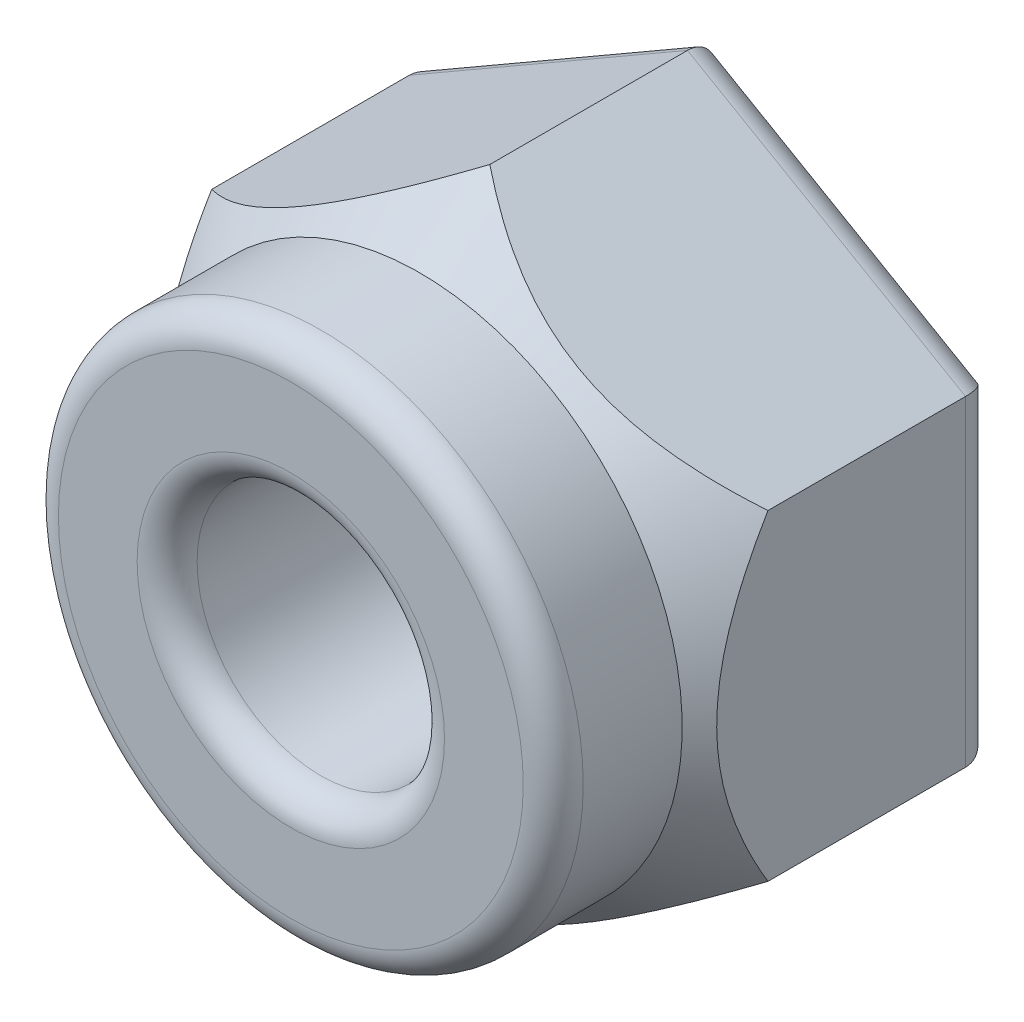
ISO-10303-21;
HEADER;
FILE_DESCRIPTION(('STEP AP214'),'2;1');
FILE_NAME('part.step','',(''),(''),'','','');
FILE_SCHEMA(('AUTOMOTIVE_DESIGN { 1 0 10303 214 1 1 1 1 }'));
ENDSEC;
DATA;
#1=APPLICATION_CONTEXT('core data for automotive mechanical design processes');
#2=APPLICATION_PROTOCOL_DEFINITION('international standard','automotive_design',2000,#1);
#3=PRODUCT_CONTEXT('',#1,'mechanical');
#4=PRODUCT('Part','Part','',(#3));
#5=PRODUCT_RELATED_PRODUCT_CATEGORY('part','',(#4));
#6=PRODUCT_DEFINITION_FORMATION('','',#4);
#7=PRODUCT_DEFINITION_CONTEXT('part definition',#1,'design');
#8=PRODUCT_DEFINITION('design','',#6,#7);
#9=PRODUCT_DEFINITION_SHAPE('','',#8);
#10=(LENGTH_UNIT() NAMED_UNIT(*) SI_UNIT(.MILLI.,.METRE.));
#11=(NAMED_UNIT(*) PLANE_ANGLE_UNIT() SI_UNIT($,.RADIAN.));
#12=(NAMED_UNIT(*) SI_UNIT($,.STERADIAN.) SOLID_ANGLE_UNIT());
#13=UNCERTAINTY_MEASURE_WITH_UNIT(LENGTH_MEASURE(1.E-05),#10,'distance_accuracy_value','');
#14=(GEOMETRIC_REPRESENTATION_CONTEXT(3) GLOBAL_UNCERTAINTY_ASSIGNED_CONTEXT((#13)) GLOBAL_UNIT_ASSIGNED_CONTEXT((#10,
#11,#12)) REPRESENTATION_CONTEXT('',''));
#15=CARTESIAN_POINT('',(0.,0.,0.));
#16=DIRECTION('',(0.,0.,1.));
#17=DIRECTION('',(1.,0.,0.));
#18=AXIS2_PLACEMENT_3D('',#15,#16,#17);
#19=CARTESIAN_POINT('',(0.,0.,7.2263));
#20=DIRECTION('',(0.,0.,-1.));
#21=DIRECTION('',(-1.,0.,0.));
#22=AXIS2_PLACEMENT_3D('',#19,#20,#21);
#23=CYLINDRICAL_SURFACE('',#22,4.445);
#24=CARTESIAN_POINT('',(0.,0.,5.04190000003746));
#25=DIRECTION('',(0.,0.,-1.));
#26=DIRECTION('',(-1.,0.,0.));
#27=AXIS2_PLACEMENT_3D('',#24,#25,#26);
#28=CIRCLE('',#27,4.44499999997561);
#29=CARTESIAN_POINT('',(-4.44499999997561,0.,5.04190000003746));
#30=VERTEX_POINT('',#29);
#31=EDGE_CURVE('E314',#30,#30,#28,.T.);
#32=ORIENTED_EDGE('',*,*,#31,.F.);
#33=EDGE_LOOP('',(#32));
#34=FACE_BOUND('',#33,.T.);
#35=CARTESIAN_POINT('',(0.,0.,6.7183));
#36=DIRECTION('',(0.,0.,1.));
#37=DIRECTION('',(1.,0.,0.));
#38=AXIS2_PLACEMENT_3D('',#35,#36,#37);
#39=CIRCLE('',#38,4.445);
#40=CARTESIAN_POINT('',(4.445,0.,6.7183));
#41=VERTEX_POINT('',#40);
#42=EDGE_CURVE('E322',#41,#41,#39,.T.);
#43=ORIENTED_EDGE('',*,*,#42,.F.);
#44=EDGE_LOOP('',(#43));
#45=FACE_BOUND('',#44,.T.);
#46=ADVANCED_FACE('F17',(#34,#45),#23,.T.);
#47=CARTESIAN_POINT('',(0.,0.,6.7183));
#48=DIRECTION('',(0.,0.,1.));
#49=DIRECTION('',(1.,0.,0.));
#50=AXIS2_PLACEMENT_3D('',#47,#48,#49);
#51=TOROIDAL_SURFACE('',#50,3.937,0.508);
#52=ORIENTED_EDGE('',*,*,#42,.T.);
#53=EDGE_LOOP('',(#52));
#54=FACE_BOUND('',#53,.T.);
#55=CARTESIAN_POINT('',(0.,0.,7.2263));
#56=DIRECTION('',(0.,0.,-1.));
#57=DIRECTION('',(1.,0.,0.));
#58=AXIS2_PLACEMENT_3D('',#55,#56,#57);
#59=CIRCLE('',#58,3.937);
#60=CARTESIAN_POINT('',(-3.937,0.,7.2263));
#61=VERTEX_POINT('',#60);
#62=CARTESIAN_POINT('',(3.937,0.,7.2263));
#63=VERTEX_POINT('',#62);
#64=EDGE_CURVE('E123',#61,#63,#59,.F.);
#65=ORIENTED_EDGE('',*,*,#64,.F.);
#66=CARTESIAN_POINT('',(0.,0.,7.2263));
#67=DIRECTION('',(0.,0.,-1.));
#68=DIRECTION('',(-1.,0.,0.));
#69=AXIS2_PLACEMENT_3D('',#66,#67,#68);
#70=CIRCLE('',#69,3.937);
#71=EDGE_CURVE('E96',#63,#61,#70,.F.);
#72=ORIENTED_EDGE('',*,*,#71,.F.);
#73=EDGE_LOOP('',(#65,#72));
#74=FACE_BOUND('',#73,.T.);
#75=ADVANCED_FACE('F165',(#54,#74),#51,.T.);
#76=CARTESIAN_POINT('',(0.,0.,3.84826803468741));
#77=DIRECTION('',(0.,0.,-1.));
#78=DIRECTION('',(-1.,0.,0.));
#79=AXIS2_PLACEMENT_3D('',#76,#77,#78);
#80=CONICAL_SURFACE('',#79,5.44657614187827,0.698131700786655);
#81=CARTESIAN_POINT('',(-1.05212635893412E-11,-5.4406025266876,3.85538711205183));
#82=CARTESIAN_POINT('',(0.0694198880657198,-5.40052293561966,3.9031448185967));
#83=CARTESIAN_POINT('',(0.139436070913134,-5.36009907360508,3.94974429032988));
#84=CARTESIAN_POINT('',(0.280788395337334,-5.27848927104819,4.04028223932267));
#85=CARTESIAN_POINT('',(0.352125145239235,-5.23730297928921,4.08421944826291));
#86=CARTESIAN_POINT('',(0.569076561166518,-5.11204602090252,4.21196533638157));
#87=CARTESIAN_POINT('',(0.71679745732688,-5.02675932173941,4.29112317393485));
#88=CARTESIAN_POINT('',(1.01853143538914,-4.85255312828151,4.43340756846604));
#89=CARTESIAN_POINT('',(1.17256221145164,-4.76362341825833,4.49648486966023));
#90=CARTESIAN_POINT('',(1.48565710023799,-4.58285799993564,4.60156597765566));
#91=CARTESIAN_POINT('',(1.64470637680685,-4.49103085729419,4.64362665851456));
#92=CARTESIAN_POINT('',(1.90795376102741,-4.33904490915099,4.69206962952762));
#93=CARTESIAN_POINT('',(2.01114804796432,-4.27946565980913,4.70585720852341));
#94=CARTESIAN_POINT('',(2.2182299788025,-4.1599068512954,4.72266472550832));
#95=CARTESIAN_POINT('',(2.3221177381314,-4.09992722548135,4.7256828237741));
#96=CARTESIAN_POINT('',(2.52913345152588,-3.98040664762657,4.72079402245974));
#97=CARTESIAN_POINT('',(2.63226247651206,-3.92086507728953,4.71294610971281));
#98=CARTESIAN_POINT('',(2.83751260976731,-3.80236385760341,4.68682455964085));
#99=CARTESIAN_POINT('',(2.93963366743113,-3.74340423747127,4.66855040154474));
#100=CARTESIAN_POINT('',(3.17043006440187,-3.61015387555222,4.61596006584314));
#101=CARTESIAN_POINT('',(3.29858413304203,-3.53616408952507,4.57859436416838));
#102=CARTESIAN_POINT('',(3.55138157924973,-3.39021141590661,4.49043444957154));
#103=CARTESIAN_POINT('',(3.67602299619301,-3.31824966028223,4.4396328953518));
#104=CARTESIAN_POINT('',(3.92196452921464,-3.17625524998729,4.32680346167458));
#105=CARTESIAN_POINT('',(4.04324919674871,-3.10623151453792,4.26473126773521));
#106=CARTESIAN_POINT('',(4.28202359863016,-2.96837504933607,4.13169736031934));
#107=CARTESIAN_POINT('',(4.39951459789339,-2.90054158928409,4.06073864917339));
#108=CARTESIAN_POINT('',(4.54832675973965,-2.81462484758345,3.96494985301448));
#109=CARTESIAN_POINT('',(4.58125036522079,-2.79561639509622,3.94337623833501));
#110=CARTESIAN_POINT('',(4.64672541736746,-2.75781435611414,3.89974829310632));
#111=CARTESIAN_POINT('',(4.67927768775033,-2.73902029404586,3.87769561134052));
#112=CARTESIAN_POINT('',(4.71170000001052,-2.72030126333469,3.85538711205183));
#113=B_SPLINE_CURVE_WITH_KNOTS('',3,(#81,#82,#83,#84,#85,#86,#87,#88,#89,#90,#91,#92,#93,#94,
#95,#96,#97,#98,#99,#100,#101,#102,#103,#104,#105,#106,#107,#108,#109,#110,#111,#112),
.UNSPECIFIED.,.F.,.F.,(4,2,2,2,2,2,2,2,2,2,2,2,2,2,2,4),(0.,0.279903528989032,0.559939374049117,
1.12338713772598,1.68854058731442,2.25215625181163,2.61157969109433,2.97106452684174,
3.32860550907442,3.68616435136073,4.14325495933245,4.60059583767107,5.05977546426689,
5.5188003723664,5.64993318826009,5.78066992692891),.UNSPECIFIED.);
#114=CARTESIAN_POINT('',(0.,-5.4406025266876,3.85538711205183));
#115=VERTEX_POINT('',#114);
#116=CARTESIAN_POINT('',(4.71170000000526,-2.7203012633438,3.85538711205183));
#117=VERTEX_POINT('',#116);
#118=EDGE_CURVE('E181',#115,#117,#113,.T.);
#119=ORIENTED_EDGE('',*,*,#118,.T.);
#120=CARTESIAN_POINT('',(4.7117,-2.72030126335291,3.85538711205183));
#121=CARTESIAN_POINT('',(4.7117,-2.6402063734187,3.90310649914751));
#122=CARTESIAN_POINT('',(4.7117,-2.55942412822034,3.94966948672825));
#123=CARTESIAN_POINT('',(4.7117,-2.39633787939989,4.0401391045916));
#124=CARTESIAN_POINT('',(4.7117,-2.31403317291738,4.0840444658659));
#125=CARTESIAN_POINT('',(4.7117,-2.06365919564088,4.21173761478695));
#126=CARTESIAN_POINT('',(4.71170000000001,-1.89315908643086,4.29087796202629));
#127=CARTESIAN_POINT('',(4.71169999999999,-1.54468800802967,4.43323224350543));
#128=CARTESIAN_POINT('',(4.71169999999996,-1.36668835921238,4.496377038607));
#129=CARTESIAN_POINT('',(4.71170000000004,-1.00494185519992,4.60153568979534));
#130=CARTESIAN_POINT('',(4.71170000000014,-0.821215118617015,4.64361623174202));
#131=CARTESIAN_POINT('',(4.71169999999992,-0.530351814319387,4.68997218617668));
#132=CARTESIAN_POINT('',(4.71169999999976,-0.424531297372244,4.70272811664239));
#133=CARTESIAN_POINT('',(4.71170000000024,-0.212474460441832,4.71976101883668));
#134=CARTESIAN_POINT('',(4.71170000000087,-0.106239966047499,4.72406020266148));
#135=CARTESIAN_POINT('',(4.71170000000098,0.121493750615701,4.7240583039678));
#136=CARTESIAN_POINT('',(4.71170000000026,0.242994656906167,4.71843378046611));
#137=CARTESIAN_POINT('',(4.71169999999974,0.485033821464658,4.69621922586504));
#138=CARTESIAN_POINT('',(4.71169999999993,0.60557155803917,4.67962361248845));
#139=CARTESIAN_POINT('',(4.71170000000007,0.84556427974083,4.63611795709083));
#140=CARTESIAN_POINT('',(4.71170000000002,0.965006984855056,4.60914100452643));
#141=CARTESIAN_POINT('',(4.71169999999998,1.20144845904031,4.54600958617114));
#142=CARTESIAN_POINT('',(4.71169999999999,1.31844653742098,4.50985256365227));
#143=CARTESIAN_POINT('',(4.7117,1.54724944788919,4.43045830591636));
#144=CARTESIAN_POINT('',(4.7117,1.65911171411081,4.38738487549243));
#145=CARTESIAN_POINT('',(4.7117,1.88014178446137,4.29476923627468));
#146=CARTESIAN_POINT('',(4.7117,1.98930884468368,4.24522526475784));
#147=CARTESIAN_POINT('',(4.7117,2.20353742687643,4.14141189108925));
#148=CARTESIAN_POINT('',(4.7117,2.30863443928403,4.08721511005738));
#149=CARTESIAN_POINT('',(4.7117,2.5162956180647,3.9744127080225));
#150=CARTESIAN_POINT('',(4.7117,2.61886238134765,3.91581188043125));
#151=CARTESIAN_POINT('',(4.7117,2.72030126335291,3.85538711205183));
#152=B_SPLINE_CURVE_WITH_KNOTS('',3,(#120,#121,#122,#123,#124,#125,#126,#127,#128,#129,#130,
#131,#132,#133,#134,#135,#136,#137,#138,#139,#140,#141,#142,#143,#144,#145,#146,#147,#148,#149,
#150,#151),.UNSPECIFIED.,.F.,.F.,(4,2,2,2,2,2,2,2,2,2,2,2,2,2,2,4),(0.,0.279678877148154,
0.559490263399245,1.12271646698533,1.68833714234389,2.25215565075588,2.57161647601366,
2.89023709399887,3.25460481118364,3.61915806770462,3.98610142374424,4.3531470889663,
4.71252002169859,5.07199106082915,5.42662119563383,5.7808707865877),.UNSPECIFIED.);
#153=CARTESIAN_POINT('',(4.71170000000526,2.7203012633438,3.85538711205183));
#154=VERTEX_POINT('',#153);
#155=EDGE_CURVE('E172',#117,#154,#152,.T.);
#156=ORIENTED_EDGE('',*,*,#155,.T.);
#157=CARTESIAN_POINT('',(4.71170000001052,2.72030126333468,3.85538711205183));
#158=CARTESIAN_POINT('',(4.64228011193428,2.76038085440262,3.9031448185967));
#159=CARTESIAN_POINT('',(4.57226392908687,2.8008047164172,3.94974429032989));
#160=CARTESIAN_POINT('',(4.43091160466267,2.88241451897409,4.04028223932267));
#161=CARTESIAN_POINT('',(4.35957485476077,2.92360081073307,4.08421944826291));
#162=CARTESIAN_POINT('',(4.14262343883348,3.04885776911975,4.21196533638157));
#163=CARTESIAN_POINT('',(3.99490254267312,3.13414446828287,4.29112317393486));
#164=CARTESIAN_POINT('',(3.69316856461086,3.30835066174077,4.43340756846604));
#165=CARTESIAN_POINT('',(3.53913778854836,3.39728037176395,4.49648486966023));
#166=CARTESIAN_POINT('',(3.22604289976202,3.57804579008664,4.60156597765566));
#167=CARTESIAN_POINT('',(3.06699362319315,3.66987293272809,4.64362665851456));
#168=CARTESIAN_POINT('',(2.80374623897259,3.82185888087129,4.69206962952762));
#169=CARTESIAN_POINT('',(2.70055195203568,3.88143813021315,4.70585720852341));
#170=CARTESIAN_POINT('',(2.4934700211975,4.00099693872688,4.72266472550832));
#171=CARTESIAN_POINT('',(2.3895822618686,4.06097656454093,4.7256828237741));
#172=CARTESIAN_POINT('',(2.18256654847412,4.18049714239571,4.72079402245974));
#173=CARTESIAN_POINT('',(2.07943752348795,4.24003871273274,4.71294610971281));
#174=CARTESIAN_POINT('',(1.87418739023269,4.35853993241887,4.68682455964085));
#175=CARTESIAN_POINT('',(1.77206633256887,4.41749955255101,4.66855040154475));
#176=CARTESIAN_POINT('',(1.54126993559813,4.55074991447006,4.61596006584314));
#177=CARTESIAN_POINT('',(1.41311586695797,4.62473970049721,4.57859436416839));
#178=CARTESIAN_POINT('',(1.16031842075027,4.77069237411567,4.49043444957154));
#179=CARTESIAN_POINT('',(1.03567700380699,4.84265412974005,4.4396328953518));
#180=CARTESIAN_POINT('',(0.789735470785362,4.98464854003499,4.32680346167458));
#181=CARTESIAN_POINT('',(0.668450803251295,5.05467227548436,4.26473126773521));
#182=CARTESIAN_POINT('',(0.429676401369839,5.19252874068621,4.13169736031934));
#183=CARTESIAN_POINT('',(0.312185402106615,5.26036220073819,4.0607386491734));
#184=CARTESIAN_POINT('',(0.163373240260348,5.34627894243883,3.96494985301449));
#185=CARTESIAN_POINT('',(0.130449634779208,5.36528739492605,3.94337623833502));
#186=CARTESIAN_POINT('',(0.0649745826325351,5.40308943390814,3.89974829310632));
#187=CARTESIAN_POINT('',(0.0324223122496691,5.42188349597642,3.87769561134052));
#188=CARTESIAN_POINT('',(-1.05244750943519E-11,5.4406025266876,3.85538711205183));
#189=B_SPLINE_CURVE_WITH_KNOTS('',3,(#157,#158,#159,#160,#161,#162,#163,#164,#165,#166,#167,
#168,#169,#170,#171,#172,#173,#174,#175,#176,#177,#178,#179,#180,#181,#182,#183,#184,#185,#186,
#187,#188),.UNSPECIFIED.,.F.,.F.,(4,2,2,2,2,2,2,2,2,2,2,2,2,2,2,4),(0.,0.279903528989032,
0.559939374049118,1.12338713772598,1.68854058731442,2.25215625181163,2.61157969109433,
2.97106452684175,3.32860550907442,3.68616435136073,4.14325495933245,4.60059583767107,
5.05977546426689,5.5188003723664,5.64993318826009,5.78066992692891),.UNSPECIFIED.);
#190=CARTESIAN_POINT('',(0.,5.4406025266876,3.85538711205183));
#191=VERTEX_POINT('',#190);
#192=EDGE_CURVE('E137',#154,#191,#189,.T.);
#193=ORIENTED_EDGE('',*,*,#192,.T.);
#194=CARTESIAN_POINT('',(1.05197955628089E-11,5.4406025266876,3.85538711205183));
#195=CARTESIAN_POINT('',(-0.0694198880657212,5.40052293561966,3.9031448185967));
#196=CARTESIAN_POINT('',(-0.139436070913136,5.36009907360508,3.94974429032988));
#197=CARTESIAN_POINT('',(-0.280788395337336,5.27848927104819,4.04028223932267));
#198=CARTESIAN_POINT('',(-0.352125145239237,5.23730297928921,4.08421944826291));
#199=CARTESIAN_POINT('',(-0.569076561166519,5.11204602090252,4.21196533638157));
#200=CARTESIAN_POINT('',(-0.716797457326881,5.02675932173941,4.29112317393485));
#201=CARTESIAN_POINT('',(-1.01853143538914,4.85255312828151,4.43340756846604));
#202=CARTESIAN_POINT('',(-1.17256221145164,4.76362341825833,4.49648486966023));
#203=CARTESIAN_POINT('',(-1.48565710023799,4.58285799993564,4.60156597765566));
#204=CARTESIAN_POINT('',(-1.64470637680685,4.49103085729419,4.64362665851456));
#205=CARTESIAN_POINT('',(-1.90795376102741,4.33904490915099,4.69206962952762));
#206=CARTESIAN_POINT('',(-2.01114804796432,4.27946565980913,4.70585720852341));
#207=CARTESIAN_POINT('',(-2.2182299788025,4.1599068512954,4.72266472550832));
#208=CARTESIAN_POINT('',(-2.3221177381314,4.09992722548135,4.7256828237741));
#209=CARTESIAN_POINT('',(-2.52913345152588,3.98040664762657,4.72079402245974));
#210=CARTESIAN_POINT('',(-2.63226247651205,3.92086507728954,4.71294610971281));
#211=CARTESIAN_POINT('',(-2.83751260976731,3.80236385760341,4.68682455964085));
#212=CARTESIAN_POINT('',(-2.93963366743113,3.74340423747127,4.66855040154474));
#213=CARTESIAN_POINT('',(-3.17043006440187,3.61015387555222,4.61596006584314));
#214=CARTESIAN_POINT('',(-3.29858413304203,3.53616408952507,4.57859436416838));
#215=CARTESIAN_POINT('',(-3.55138157924973,3.39021141590661,4.49043444957154));
#216=CARTESIAN_POINT('',(-3.67602299619301,3.31824966028223,4.4396328953518));
#217=CARTESIAN_POINT('',(-3.92196452921464,3.17625524998729,4.32680346167458));
#218=CARTESIAN_POINT('',(-4.04324919674871,3.10623151453792,4.26473126773521));
#219=CARTESIAN_POINT('',(-4.28202359863016,2.96837504933607,4.13169736031934));
#220=CARTESIAN_POINT('',(-4.39951459789339,2.90054158928409,4.06073864917339));
#221=CARTESIAN_POINT('',(-4.54832675973965,2.81462484758345,3.96494985301448));
#222=CARTESIAN_POINT('',(-4.58125036522079,2.79561639509623,3.94337623833501));
#223=CARTESIAN_POINT('',(-4.64672541736746,2.75781435611414,3.89974829310632));
#224=CARTESIAN_POINT('',(-4.67927768775033,2.73902029404586,3.87769561134051));
#225=CARTESIAN_POINT('',(-4.71170000001052,2.72030126333469,3.85538711205183));
#226=B_SPLINE_CURVE_WITH_KNOTS('',3,(#194,#195,#196,#197,#198,#199,#200,#201,#202,#203,#204,
#205,#206,#207,#208,#209,#210,#211,#212,#213,#214,#215,#216,#217,#218,#219,#220,#221,#222,#223,
#224,#225),.UNSPECIFIED.,.F.,.F.,(4,2,2,2,2,2,2,2,2,2,2,2,2,2,2,4),(0.,0.279903528989032,
0.559939374049118,1.12338713772598,1.68854058731442,2.25215625181163,2.61157969109433,
2.97106452684174,3.32860550907442,3.68616435136073,4.14325495933245,4.60059583767106,
5.05977546426689,5.5188003723664,5.64993318826009,5.78066992692891),.UNSPECIFIED.);
#227=CARTESIAN_POINT('',(-4.7117,2.72030126334684,3.85538711205545));
#228=VERTEX_POINT('',#227);
#229=EDGE_CURVE('E128',#191,#228,#226,.T.);
#230=ORIENTED_EDGE('',*,*,#229,.T.);
#231=CARTESIAN_POINT('',(-4.7117,2.72030126335291,3.85538711205183));
#232=CARTESIAN_POINT('',(-4.7117,2.6402063734187,3.90310649914751));
#233=CARTESIAN_POINT('',(-4.7117,2.55942412822034,3.94966948672825));
#234=CARTESIAN_POINT('',(-4.7117,2.39633787939989,4.04013910459159));
#235=CARTESIAN_POINT('',(-4.7117,2.31403317291738,4.0840444658659));
#236=CARTESIAN_POINT('',(-4.7117,2.06365919564088,4.21173761478695));
#237=CARTESIAN_POINT('',(-4.71170000000001,1.89315908643086,4.29087796202629));
#238=CARTESIAN_POINT('',(-4.71169999999999,1.54468800802967,4.43323224350543));
#239=CARTESIAN_POINT('',(-4.71169999999996,1.36668835921238,4.496377038607));
#240=CARTESIAN_POINT('',(-4.71170000000004,1.00494185519992,4.60153568979534));
#241=CARTESIAN_POINT('',(-4.71170000000014,0.821215118617016,4.64361623174201));
#242=CARTESIAN_POINT('',(-4.71169999999992,0.530351814319387,4.68997218617668));
#243=CARTESIAN_POINT('',(-4.71169999999976,0.424531297372245,4.70272811664239));
#244=CARTESIAN_POINT('',(-4.71170000000024,0.212474460441832,4.71976101883668));
#245=CARTESIAN_POINT('',(-4.71170000000087,0.1062399660475,4.72406020266148));
#246=CARTESIAN_POINT('',(-4.71170000000098,-0.121493750615701,4.7240583039678));
#247=CARTESIAN_POINT('',(-4.71170000000026,-0.242994656906166,4.71843378046611));
#248=CARTESIAN_POINT('',(-4.71169999999974,-0.485033821464658,4.69621922586504));
#249=CARTESIAN_POINT('',(-4.71169999999993,-0.60557155803917,4.67962361248845));
#250=CARTESIAN_POINT('',(-4.71170000000007,-0.84556427974083,4.63611795709083));
#251=CARTESIAN_POINT('',(-4.71170000000002,-0.965006984855056,4.60914100452643));
#252=CARTESIAN_POINT('',(-4.71169999999998,-1.20144845904031,4.54600958617114));
#253=CARTESIAN_POINT('',(-4.71169999999999,-1.31844653742098,4.50985256365227));
#254=CARTESIAN_POINT('',(-4.7117,-1.54724944788919,4.43045830591636));
#255=CARTESIAN_POINT('',(-4.7117,-1.65911171411081,4.38738487549243));
#256=CARTESIAN_POINT('',(-4.7117,-1.88014178446137,4.29476923627468));
#257=CARTESIAN_POINT('',(-4.7117,-1.98930884468368,4.24522526475784));
#258=CARTESIAN_POINT('',(-4.7117,-2.20353742687644,4.14141189108925));
#259=CARTESIAN_POINT('',(-4.7117,-2.30863443928403,4.08721511005738));
#260=CARTESIAN_POINT('',(-4.7117,-2.5162956180647,3.9744127080225));
#261=CARTESIAN_POINT('',(-4.7117,-2.61886238134765,3.91581188043125));
#262=CARTESIAN_POINT('',(-4.7117,-2.72030126335291,3.85538711205183));
#263=B_SPLINE_CURVE_WITH_KNOTS('',3,(#231,#232,#233,#234,#235,#236,#237,#238,#239,#240,#241,
#242,#243,#244,#245,#246,#247,#248,#249,#250,#251,#252,#253,#254,#255,#256,#257,#258,#259,#260,
#261,#262),.UNSPECIFIED.,.F.,.F.,(4,2,2,2,2,2,2,2,2,2,2,2,2,2,2,4),(0.,0.279678877148154,
0.559490263399245,1.12271646698533,1.68833714234389,2.25215565075588,2.57161647601366,
2.89023709399887,3.25460481118364,3.61915806770462,3.98610142374424,4.3531470889663,
4.71252002169859,5.07199106082915,5.42662119563384,5.7808707865877),.UNSPECIFIED.);
#264=CARTESIAN_POINT('',(-4.71170000000526,-2.7203012633438,3.85538711205183));
#265=VERTEX_POINT('',#264);
#266=EDGE_CURVE('E114',#228,#265,#263,.T.);
#267=ORIENTED_EDGE('',*,*,#266,.T.);
#268=CARTESIAN_POINT('',(-4.71170000001052,-2.72030126333469,3.85538711205183));
#269=CARTESIAN_POINT('',(-4.64228011193428,-2.76038085440262,3.9031448185967));
#270=CARTESIAN_POINT('',(-4.57226392908687,-2.8008047164172,3.94974429032989));
#271=CARTESIAN_POINT('',(-4.43091160466267,-2.88241451897409,4.04028223932267));
#272=CARTESIAN_POINT('',(-4.35957485476076,-2.92360081073307,4.08421944826291));
#273=CARTESIAN_POINT('',(-4.14262343883348,-3.04885776911976,4.21196533638157));
#274=CARTESIAN_POINT('',(-3.99490254267312,-3.13414446828287,4.29112317393485));
#275=CARTESIAN_POINT('',(-3.69316856461087,-3.30835066174077,4.43340756846604));
#276=CARTESIAN_POINT('',(-3.53913778854836,-3.39728037176395,4.49648486966023));
#277=CARTESIAN_POINT('',(-3.22604289976202,-3.57804579008664,4.60156597765566));
#278=CARTESIAN_POINT('',(-3.06699362319316,-3.66987293272809,4.64362665851456));
#279=CARTESIAN_POINT('',(-2.80374623897259,-3.82185888087129,4.69206962952762));
#280=CARTESIAN_POINT('',(-2.70055195203569,-3.88143813021315,4.70585720852341));
#281=CARTESIAN_POINT('',(-2.49347002119751,-4.00099693872688,4.72266472550832));
#282=CARTESIAN_POINT('',(-2.38958226186861,-4.06097656454093,4.7256828237741));
#283=CARTESIAN_POINT('',(-2.18256654847413,-4.18049714239571,4.72079402245974));
#284=CARTESIAN_POINT('',(-2.07943752348795,-4.24003871273274,4.71294610971281));
#285=CARTESIAN_POINT('',(-1.8741873902327,-4.35853993241887,4.68682455964085));
#286=CARTESIAN_POINT('',(-1.77206633256888,-4.41749955255101,4.66855040154474));
#287=CARTESIAN_POINT('',(-1.54126993559814,-4.55074991447006,4.61596006584314));
#288=CARTESIAN_POINT('',(-1.41311586695797,-4.62473970049721,4.57859436416838));
#289=CARTESIAN_POINT('',(-1.16031842075028,-4.77069237411567,4.49043444957154));
#290=CARTESIAN_POINT('',(-1.035677003807,-4.84265412974005,4.4396328953518));
#291=CARTESIAN_POINT('',(-0.789735470785368,-4.98464854003499,4.32680346167458));
#292=CARTESIAN_POINT('',(-0.6684508032513,-5.05467227548436,4.26473126773521));
#293=CARTESIAN_POINT('',(-0.429676401369845,-5.19252874068621,4.13169736031934));
#294=CARTESIAN_POINT('',(-0.312185402106622,-5.26036220073819,4.06073864917339));
#295=CARTESIAN_POINT('',(-0.163373240260353,-5.34627894243883,3.96494985301448));
#296=CARTESIAN_POINT('',(-0.130449634779214,-5.36528739492605,3.94337623833501));
#297=CARTESIAN_POINT('',(-0.0649745826325401,-5.40308943390814,3.89974829310632));
#298=CARTESIAN_POINT('',(-0.0324223122496736,-5.42188349597642,3.87769561134052));
#299=CARTESIAN_POINT('',(1.05200175076249E-11,-5.4406025266876,3.85538711205183));
#300=B_SPLINE_CURVE_WITH_KNOTS('',3,(#268,#269,#270,#271,#272,#273,#274,#275,#276,#277,#278,
#279,#280,#281,#282,#283,#284,#285,#286,#287,#288,#289,#290,#291,#292,#293,#294,#295,#296,#297,
#298,#299),.UNSPECIFIED.,.F.,.F.,(4,2,2,2,2,2,2,2,2,2,2,2,2,2,2,4),(0.,0.279903528989032,
0.559939374049116,1.12338713772598,1.68854058731442,2.25215625181162,2.61157969109432,
2.97106452684174,3.32860550907442,3.68616435136073,4.14325495933245,4.60059583767106,
5.05977546426688,5.51880037236639,5.64993318826008,5.78066992692891),.UNSPECIFIED.);
#301=EDGE_CURVE('E89',#265,#115,#300,.T.);
#302=ORIENTED_EDGE('',*,*,#301,.T.);
#303=EDGE_LOOP('',(#119,#156,#193,#230,#267,#302));
#304=FACE_BOUND('',#303,.T.);
#305=ORIENTED_EDGE('',*,*,#31,.T.);
#306=EDGE_LOOP('',(#305));
#307=FACE_BOUND('',#306,.T.);
#308=ADVANCED_FACE('F134',(#304,#307),#80,.T.);
#309=CARTESIAN_POINT('',(0.,0.,7.2263));
#310=DIRECTION('',(0.,0.,1.));
#311=DIRECTION('',(1.,0.,0.));
#312=AXIS2_PLACEMENT_3D('',#309,#310,#311);
#313=PLANE('',#312);
#314=ORIENTED_EDGE('',*,*,#71,.T.);
#315=ORIENTED_EDGE('',*,*,#64,.T.);
#316=EDGE_LOOP('',(#314,#315));
#317=FACE_BOUND('',#316,.T.);
#318=CARTESIAN_POINT('',(0.,0.,7.2263));
#319=DIRECTION('',(0.,0.,1.));
#320=DIRECTION('',(-1.,0.,0.));
#321=AXIS2_PLACEMENT_3D('',#318,#319,#320);
#322=CIRCLE('',#321,2.6035);
#323=CARTESIAN_POINT('',(-2.6035,0.,7.2263));
#324=VERTEX_POINT('',#323);
#325=CARTESIAN_POINT('',(2.6035,0.,7.2263));
#326=VERTEX_POINT('',#325);
#327=EDGE_CURVE('E107',#324,#326,#322,.T.);
#328=ORIENTED_EDGE('',*,*,#327,.F.);
#329=CARTESIAN_POINT('',(0.,0.,7.2263));
#330=DIRECTION('',(0.,0.,1.));
#331=DIRECTION('',(1.,0.,0.));
#332=AXIS2_PLACEMENT_3D('',#329,#330,#331);
#333=CIRCLE('',#332,2.6035);
#334=EDGE_CURVE('E274',#326,#324,#333,.T.);
#335=ORIENTED_EDGE('',*,*,#334,.F.);
#336=EDGE_LOOP('',(#328,#335));
#337=FACE_BOUND('',#336,.T.);
#338=ADVANCED_FACE('F164',(#317,#337),#313,.T.);
#339=CARTESIAN_POINT('',(-4.7117,2.72030126334076,5.0419));
#340=DIRECTION('',(1.,0.,0.));
#341=DIRECTION('',(0.,1.,0.));
#342=AXIS2_PLACEMENT_3D('',#339,#340,#341);
#343=PLANE('',#342);
#344=DIRECTION('',(0.,-1.,0.));
#345=VECTOR('',#344,1.);
#346=CARTESIAN_POINT('',(-4.7117,2.72030126334076,0.508));
#347=LINE('',#346,#345);
#348=CARTESIAN_POINT('',(-4.7117,-2.72030126334076,0.508));
#349=VERTEX_POINT('',#348);
#350=CARTESIAN_POINT('',(-4.7117,2.72030126334076,0.508));
#351=VERTEX_POINT('',#350);
#352=EDGE_CURVE('E346',#349,#351,#347,.F.);
#353=ORIENTED_EDGE('',*,*,#352,.F.);
#354=DIRECTION('',(0.,0.,1.));
#355=VECTOR('',#354,1.);
#356=CARTESIAN_POINT('',(-4.7117,-2.72030126334076,5.0419));
#357=LINE('',#356,#355);
#358=EDGE_CURVE('E120',#349,#265,#357,.T.);
#359=ORIENTED_EDGE('',*,*,#358,.T.);
#360=ORIENTED_EDGE('',*,*,#266,.F.);
#361=DIRECTION('',(0.,0.,1.));
#362=VECTOR('',#361,1.);
#363=CARTESIAN_POINT('',(-4.7117,2.72030126334076,5.0419));
#364=LINE('',#363,#362);
#365=EDGE_CURVE('E118',#228,#351,#364,.F.);
#366=ORIENTED_EDGE('',*,*,#365,.T.);
#367=EDGE_LOOP('',(#353,#359,#360,#366));
#368=FACE_BOUND('',#367,.T.);
#369=ADVANCED_FACE('F117',(#368),#343,.F.);
#370=CARTESIAN_POINT('',(-4.7117,-2.72030126334076,5.0419));
#371=DIRECTION('',(0.5,0.866025403784438,0.));
#372=DIRECTION('',(-0.866025403784438,0.5,0.));
#373=AXIS2_PLACEMENT_3D('',#370,#371,#372);
#374=PLANE('',#373);
#375=DIRECTION('',(0.866025403784438,-0.5,0.));
#376=VECTOR('',#375,1.);
#377=CARTESIAN_POINT('',(-4.7117,-2.72030126334076,0.508));
#378=LINE('',#377,#376);
#379=CARTESIAN_POINT('',(0.,-5.44060252668152,0.508));
#380=VERTEX_POINT('',#379);
#381=EDGE_CURVE('E336',#380,#349,#378,.F.);
#382=ORIENTED_EDGE('',*,*,#381,.F.);
#383=DIRECTION('',(0.,0.,1.));
#384=VECTOR('',#383,1.);
#385=CARTESIAN_POINT('',(0.,-5.44060252668152,5.0419));
#386=LINE('',#385,#384);
#387=EDGE_CURVE('E260',#380,#115,#386,.T.);
#388=ORIENTED_EDGE('',*,*,#387,.T.);
#389=ORIENTED_EDGE('',*,*,#301,.F.);
#390=ORIENTED_EDGE('',*,*,#358,.F.);
#391=EDGE_LOOP('',(#382,#388,#389,#390));
#392=FACE_BOUND('',#391,.T.);
#393=ADVANCED_FACE('F198',(#392),#374,.F.);
#394=CARTESIAN_POINT('',(0.,-5.44060252668152,5.0419));
#395=DIRECTION('',(-0.5,0.866025403784439,0.));
#396=DIRECTION('',(-0.866025403784439,-0.5,0.));
#397=AXIS2_PLACEMENT_3D('',#394,#395,#396);
#398=PLANE('',#397);
#399=DIRECTION('',(0.866025403784439,0.5,0.));
#400=VECTOR('',#399,1.);
#401=CARTESIAN_POINT('',(0.,-5.44060252668152,0.508));
#402=LINE('',#401,#400);
#403=CARTESIAN_POINT('',(4.7117,-2.72030126334076,0.508));
#404=VERTEX_POINT('',#403);
#405=EDGE_CURVE('E334',#404,#380,#402,.F.);
#406=ORIENTED_EDGE('',*,*,#405,.F.);
#407=DIRECTION('',(0.,0.,1.));
#408=VECTOR('',#407,1.);
#409=CARTESIAN_POINT('',(4.7117,-2.72030126334076,5.0419));
#410=LINE('',#409,#408);
#411=EDGE_CURVE('E257',#404,#117,#410,.T.);
#412=ORIENTED_EDGE('',*,*,#411,.T.);
#413=ORIENTED_EDGE('',*,*,#118,.F.);
#414=ORIENTED_EDGE('',*,*,#387,.F.);
#415=EDGE_LOOP('',(#406,#412,#413,#414));
#416=FACE_BOUND('',#415,.T.);
#417=ADVANCED_FACE('F201',(#416),#398,.F.);
#418=CARTESIAN_POINT('',(4.7117,-2.72030126334076,5.0419));
#419=DIRECTION('',(-1.,0.,0.));
#420=DIRECTION('',(0.,0.,1.));
#421=AXIS2_PLACEMENT_3D('',#418,#419,#420);
#422=PLANE('',#421);
#423=DIRECTION('',(0.,1.,0.));
#424=VECTOR('',#423,1.);
#425=CARTESIAN_POINT('',(4.7117,-2.72030126334076,0.508));
#426=LINE('',#425,#424);
#427=CARTESIAN_POINT('',(4.7117,2.72030126334076,0.508));
#428=VERTEX_POINT('',#427);
#429=EDGE_CURVE('E332',#428,#404,#426,.F.);
#430=ORIENTED_EDGE('',*,*,#429,.F.);
#431=DIRECTION('',(0.,0.,1.));
#432=VECTOR('',#431,1.);
#433=CARTESIAN_POINT('',(4.7117,2.72030126334076,5.0419));
#434=LINE('',#433,#432);
#435=EDGE_CURVE('E139',#428,#154,#434,.T.);
#436=ORIENTED_EDGE('',*,*,#435,.T.);
#437=ORIENTED_EDGE('',*,*,#155,.F.);
#438=ORIENTED_EDGE('',*,*,#411,.F.);
#439=EDGE_LOOP('',(#430,#436,#437,#438));
#440=FACE_BOUND('',#439,.T.);
#441=ADVANCED_FACE('F378',(#440),#422,.F.);
#442=CARTESIAN_POINT('',(4.7117,2.72030126334076,5.0419));
#443=DIRECTION('',(-0.5,-0.866025403784439,0.));
#444=DIRECTION('',(0.866025403784439,-0.5,0.));
#445=AXIS2_PLACEMENT_3D('',#442,#443,#444);
#446=PLANE('',#445);
#447=DIRECTION('',(-0.866025403784439,0.5,0.));
#448=VECTOR('',#447,1.);
#449=CARTESIAN_POINT('',(4.7117,2.72030126334076,0.508));
#450=LINE('',#449,#448);
#451=CARTESIAN_POINT('',(0.,5.44060252668152,0.508));
#452=VERTEX_POINT('',#451);
#453=EDGE_CURVE('E329',#452,#428,#450,.F.);
#454=ORIENTED_EDGE('',*,*,#453,.F.);
#455=DIRECTION('',(0.,0.,1.));
#456=VECTOR('',#455,1.);
#457=CARTESIAN_POINT('',(0.,5.44060252668152,5.0419));
#458=LINE('',#457,#456);
#459=EDGE_CURVE('E131',#452,#191,#458,.T.);
#460=ORIENTED_EDGE('',*,*,#459,.T.);
#461=ORIENTED_EDGE('',*,*,#192,.F.);
#462=ORIENTED_EDGE('',*,*,#435,.F.);
#463=EDGE_LOOP('',(#454,#460,#461,#462));
#464=FACE_BOUND('',#463,.T.);
#465=ADVANCED_FACE('F380',(#464),#446,.F.);
#466=CARTESIAN_POINT('',(0.,5.44060252668152,5.0419));
#467=DIRECTION('',(0.5,-0.866025403784439,0.));
#468=DIRECTION('',(0.866025403784439,0.5,0.));
#469=AXIS2_PLACEMENT_3D('',#466,#467,#468);
#470=PLANE('',#469);
#471=DIRECTION('',(-0.866025403784439,-0.5,0.));
#472=VECTOR('',#471,1.);
#473=CARTESIAN_POINT('',(0.,5.44060252668152,0.508));
#474=LINE('',#473,#472);
#475=EDGE_CURVE('E130',#351,#452,#474,.F.);
#476=ORIENTED_EDGE('',*,*,#475,.F.);
#477=ORIENTED_EDGE('',*,*,#365,.F.);
#478=ORIENTED_EDGE('',*,*,#229,.F.);
#479=ORIENTED_EDGE('',*,*,#459,.F.);
#480=EDGE_LOOP('',(#476,#477,#478,#479));
#481=FACE_BOUND('',#480,.T.);
#482=ADVANCED_FACE('F126',(#481),#470,.F.);
#483=CARTESIAN_POINT('',(0.,0.,6.7183));
#484=DIRECTION('',(0.,0.,1.));
#485=DIRECTION('',(1.,0.,0.));
#486=AXIS2_PLACEMENT_3D('',#483,#484,#485);
#487=TOROIDAL_SURFACE('',#486,2.6035,0.508);
#488=CARTESIAN_POINT('',(0.,0.,6.7183));
#489=DIRECTION('',(0.,0.,1.));
#490=DIRECTION('',(1.,0.,0.));
#491=AXIS2_PLACEMENT_3D('',#488,#489,#490);
#492=CIRCLE('',#491,2.0955);
#493=CARTESIAN_POINT('',(2.0955,0.,6.7183));
#494=VERTEX_POINT('',#493);
#495=EDGE_CURVE('E254',#494,#494,#492,.F.);
#496=ORIENTED_EDGE('',*,*,#495,.T.);
#497=EDGE_LOOP('',(#496));
#498=FACE_BOUND('',#497,.T.);
#499=ORIENTED_EDGE('',*,*,#334,.T.);
#500=ORIENTED_EDGE('',*,*,#327,.T.);
#501=EDGE_LOOP('',(#499,#500));
#502=FACE_BOUND('',#501,.T.);
#503=ADVANCED_FACE('F243',(#498,#502),#487,.T.);
#504=CARTESIAN_POINT('',(-4.2037,2.72030126334076,0.508));
#505=DIRECTION('',(0.,-1.,0.));
#506=DIRECTION('',(1.,0.,0.));
#507=AXIS2_PLACEMENT_3D('',#504,#505,#506);
#508=CYLINDRICAL_SURFACE('',#507,0.508);
#509=CARTESIAN_POINT('',(-4.2037,2.42700732659243,0.508));
#510=DIRECTION('',(-0.5,-0.866025403784439,0.));
#511=DIRECTION('',(-0.866025403784439,0.5,0.));
#512=AXIS2_PLACEMENT_3D('',#509,#510,#511);
#513=ELLIPSE('',#512,0.58658787349666,0.508);
#514=CARTESIAN_POINT('',(-4.2037,2.42700732659243,0.));
#515=VERTEX_POINT('',#514);
#516=EDGE_CURVE('E326',#515,#351,#513,.F.);
#517=ORIENTED_EDGE('',*,*,#516,.F.);
#518=DIRECTION('',(0.,1.,0.));
#519=VECTOR('',#518,1.);
#520=CARTESIAN_POINT('',(-4.2037,-5.44060252668152,0.));
#521=LINE('',#520,#519);
#522=CARTESIAN_POINT('',(-4.2037,-2.42700732659243,0.));
#523=VERTEX_POINT('',#522);
#524=EDGE_CURVE('E360',#515,#523,#521,.F.);
#525=ORIENTED_EDGE('',*,*,#524,.T.);
#526=CARTESIAN_POINT('',(-4.2037,-2.42700732659243,0.508));
#527=DIRECTION('',(0.5,-0.866025403784439,0.));
#528=DIRECTION('',(0.866025403784439,0.5,0.));
#529=AXIS2_PLACEMENT_3D('',#526,#527,#528);
#530=ELLIPSE('',#529,0.586587873496659,0.508);
#531=EDGE_CURVE('E151',#349,#523,#530,.T.);
#532=ORIENTED_EDGE('',*,*,#531,.F.);
#533=ORIENTED_EDGE('',*,*,#352,.T.);
#534=EDGE_LOOP('',(#517,#525,#532,#533));
#535=FACE_BOUND('',#534,.T.);
#536=ADVANCED_FACE('F240',(#535),#508,.T.);
#537=CARTESIAN_POINT('',(-4.4577,-2.28036035821827,0.508));
#538=DIRECTION('',(0.866025403784438,-0.5,0.));
#539=DIRECTION('',(0.5,0.866025403784438,0.));
#540=AXIS2_PLACEMENT_3D('',#537,#538,#539);
#541=CYLINDRICAL_SURFACE('',#540,0.508);
#542=CARTESIAN_POINT('',(0.,-4.85401465318486,0.508));
#543=DIRECTION('',(1.,0.,0.));
#544=DIRECTION('',(0.,1.,0.));
#545=AXIS2_PLACEMENT_3D('',#542,#543,#544);
#546=ELLIPSE('',#545,0.58658787349666,0.508);
#547=CARTESIAN_POINT('',(0.,-4.85401465318486,0.));
#548=VERTEX_POINT('',#547);
#549=EDGE_CURVE('E335',#380,#548,#546,.T.);
#550=ORIENTED_EDGE('',*,*,#549,.F.);
#551=ORIENTED_EDGE('',*,*,#381,.T.);
#552=ORIENTED_EDGE('',*,*,#531,.T.);
#553=DIRECTION('',(0.866025403784438,-0.5,0.));
#554=VECTOR('',#553,1.);
#555=CARTESIAN_POINT('',(-4.2037,-2.42700732659243,0.));
#556=LINE('',#555,#554);
#557=EDGE_CURVE('E348',#523,#548,#556,.T.);
#558=ORIENTED_EDGE('',*,*,#557,.T.);
#559=EDGE_LOOP('',(#550,#551,#552,#558));
#560=FACE_BOUND('',#559,.T.);
#561=ADVANCED_FACE('F236',(#560),#541,.T.);
#562=CARTESIAN_POINT('',(-0.254000000000001,-5.00066162155903,0.508));
#563=DIRECTION('',(0.866025403784439,0.5,0.));
#564=DIRECTION('',(-0.5,0.866025403784439,0.));
#565=AXIS2_PLACEMENT_3D('',#562,#563,#564);
#566=CYLINDRICAL_SURFACE('',#565,0.508);
#567=CARTESIAN_POINT('',(4.2037,-2.42700732659243,0.508));
#568=DIRECTION('',(0.5,0.866025403784439,0.));
#569=DIRECTION('',(-0.866025403784439,0.5,0.));
#570=AXIS2_PLACEMENT_3D('',#567,#568,#569);
#571=ELLIPSE('',#570,0.58658787349666,0.508);
#572=CARTESIAN_POINT('',(4.2037,-2.42700732659243,0.));
#573=VERTEX_POINT('',#572);
#574=EDGE_CURVE('E333',#404,#573,#571,.T.);
#575=ORIENTED_EDGE('',*,*,#574,.F.);
#576=ORIENTED_EDGE('',*,*,#405,.T.);
#577=ORIENTED_EDGE('',*,*,#549,.T.);
#578=DIRECTION('',(0.866025403784439,0.5,0.));
#579=VECTOR('',#578,1.);
#580=CARTESIAN_POINT('',(0.,-4.85401465318486,0.));
#581=LINE('',#580,#579);
#582=EDGE_CURVE('E366',#548,#573,#581,.T.);
#583=ORIENTED_EDGE('',*,*,#582,.T.);
#584=EDGE_LOOP('',(#575,#576,#577,#583));
#585=FACE_BOUND('',#584,.T.);
#586=ADVANCED_FACE('F232',(#585),#566,.T.);
#587=CARTESIAN_POINT('',(4.2037,-2.72030126334076,0.508));
#588=DIRECTION('',(0.,1.,0.));
#589=DIRECTION('',(0.,0.,1.));
#590=AXIS2_PLACEMENT_3D('',#587,#588,#589);
#591=CYLINDRICAL_SURFACE('',#590,0.508);
#592=CARTESIAN_POINT('',(4.2037,2.42700732659243,0.508));
#593=DIRECTION('',(-0.5,0.866025403784439,0.));
#594=DIRECTION('',(-0.866025403784439,-0.5,0.));
#595=AXIS2_PLACEMENT_3D('',#592,#593,#594);
#596=ELLIPSE('',#595,0.58658787349666,0.508);
#597=CARTESIAN_POINT('',(4.2037,2.42700732659243,0.));
#598=VERTEX_POINT('',#597);
#599=EDGE_CURVE('E330',#428,#598,#596,.T.);
#600=ORIENTED_EDGE('',*,*,#599,.F.);
#601=ORIENTED_EDGE('',*,*,#429,.T.);
#602=ORIENTED_EDGE('',*,*,#574,.T.);
#603=DIRECTION('',(0.,1.,0.));
#604=VECTOR('',#603,1.);
#605=CARTESIAN_POINT('',(4.2037,-5.44060252668152,0.));
#606=LINE('',#605,#604);
#607=EDGE_CURVE('E356',#573,#598,#606,.T.);
#608=ORIENTED_EDGE('',*,*,#607,.T.);
#609=EDGE_LOOP('',(#600,#601,#602,#608));
#610=FACE_BOUND('',#609,.T.);
#611=ADVANCED_FACE('F228',(#610),#591,.T.);
#612=CARTESIAN_POINT('',(4.4577,2.28036035821826,0.508));
#613=DIRECTION('',(-0.866025403784439,0.5,0.));
#614=DIRECTION('',(-0.5,-0.866025403784439,0.));
#615=AXIS2_PLACEMENT_3D('',#612,#613,#614);
#616=CYLINDRICAL_SURFACE('',#615,0.508);
#617=CARTESIAN_POINT('',(0.,4.85401465318486,0.508));
#618=DIRECTION('',(-1.,0.,0.));
#619=DIRECTION('',(0.,-1.,0.));
#620=AXIS2_PLACEMENT_3D('',#617,#618,#619);
#621=ELLIPSE('',#620,0.58658787349666,0.508);
#622=CARTESIAN_POINT('',(0.,4.85401465318486,0.));
#623=VERTEX_POINT('',#622);
#624=EDGE_CURVE('E36',#452,#623,#621,.T.);
#625=ORIENTED_EDGE('',*,*,#624,.F.);
#626=ORIENTED_EDGE('',*,*,#453,.T.);
#627=ORIENTED_EDGE('',*,*,#599,.T.);
#628=DIRECTION('',(-0.866025403784439,0.5,0.));
#629=VECTOR('',#628,1.);
#630=CARTESIAN_POINT('',(4.2037,2.42700732659243,0.));
#631=LINE('',#630,#629);
#632=EDGE_CURVE('E354',#598,#623,#631,.T.);
#633=ORIENTED_EDGE('',*,*,#632,.T.);
#634=EDGE_LOOP('',(#625,#626,#627,#633));
#635=FACE_BOUND('',#634,.T.);
#636=ADVANCED_FACE('F225',(#635),#616,.T.);
#637=CARTESIAN_POINT('',(0.253999999999998,5.00066162155902,0.508));
#638=DIRECTION('',(-0.866025403784439,-0.5,0.));
#639=DIRECTION('',(0.5,-0.866025403784439,0.));
#640=AXIS2_PLACEMENT_3D('',#637,#638,#639);
#641=CYLINDRICAL_SURFACE('',#640,0.508);
#642=ORIENTED_EDGE('',*,*,#624,.T.);
#643=DIRECTION('',(-0.866025403784439,-0.5,0.));
#644=VECTOR('',#643,1.);
#645=CARTESIAN_POINT('',(0.,4.85401465318486,0.));
#646=LINE('',#645,#644);
#647=EDGE_CURVE('E27',#623,#515,#646,.T.);
#648=ORIENTED_EDGE('',*,*,#647,.T.);
#649=ORIENTED_EDGE('',*,*,#516,.T.);
#650=ORIENTED_EDGE('',*,*,#475,.T.);
#651=EDGE_LOOP('',(#642,#648,#649,#650));
#652=FACE_BOUND('',#651,.T.);
#653=ADVANCED_FACE('F217',(#652),#641,.T.);
#654=CARTESIAN_POINT('',(0.,0.,0.));
#655=DIRECTION('',(0.,0.,1.));
#656=DIRECTION('',(1.,0.,0.));
#657=AXIS2_PLACEMENT_3D('',#654,#655,#656);
#658=CYLINDRICAL_SURFACE('',#657,2.0955);
#659=CARTESIAN_POINT('',(0.,0.,0.));
#660=DIRECTION('',(0.,0.,1.));
#661=DIRECTION('',(1.,0.,0.));
#662=AXIS2_PLACEMENT_3D('',#659,#660,#661);
#663=CIRCLE('',#662,2.0955);
#664=CARTESIAN_POINT('',(2.0955,0.,0.));
#665=VERTEX_POINT('',#664);
#666=EDGE_CURVE('E11',#665,#665,#663,.F.);
#667=ORIENTED_EDGE('',*,*,#666,.T.);
#668=EDGE_LOOP('',(#667));
#669=FACE_BOUND('',#668,.T.);
#670=ORIENTED_EDGE('',*,*,#495,.F.);
#671=EDGE_LOOP('',(#670));
#672=FACE_BOUND('',#671,.T.);
#673=ADVANCED_FACE('F211',(#669,#672),#658,.F.);
#674=CARTESIAN_POINT('',(0.,-5.44060252668152,0.));
#675=DIRECTION('',(0.,0.,1.));
#676=DIRECTION('',(1.,0.,0.));
#677=AXIS2_PLACEMENT_3D('',#674,#675,#676);
#678=PLANE('',#677);
#679=ORIENTED_EDGE('',*,*,#666,.F.);
#680=EDGE_LOOP('',(#679));
#681=FACE_BOUND('',#680,.T.);
#682=ORIENTED_EDGE('',*,*,#632,.F.);
#683=ORIENTED_EDGE('',*,*,#607,.F.);
#684=ORIENTED_EDGE('',*,*,#582,.F.);
#685=ORIENTED_EDGE('',*,*,#557,.F.);
#686=ORIENTED_EDGE('',*,*,#524,.F.);
#687=ORIENTED_EDGE('',*,*,#647,.F.);
#688=EDGE_LOOP('',(#682,#683,#684,#685,#686,#687));
#689=FACE_BOUND('',#688,.T.);
#690=ADVANCED_FACE('F209',(#681,#689),#678,.F.);
#691=CLOSED_SHELL('',(#46,#75,#308,#338,#369,#393,#417,#441,#465,#482,#503,#536,#561,#586,#611,
#636,#653,#673,#690));
#692=MANIFOLD_SOLID_BREP('B1',#691);
#693=ADVANCED_BREP_SHAPE_REPRESENTATION('',(#18,#692),#14);
#694=SHAPE_DEFINITION_REPRESENTATION(#9,#693);
ENDSEC;
END-ISO-10303-21;
